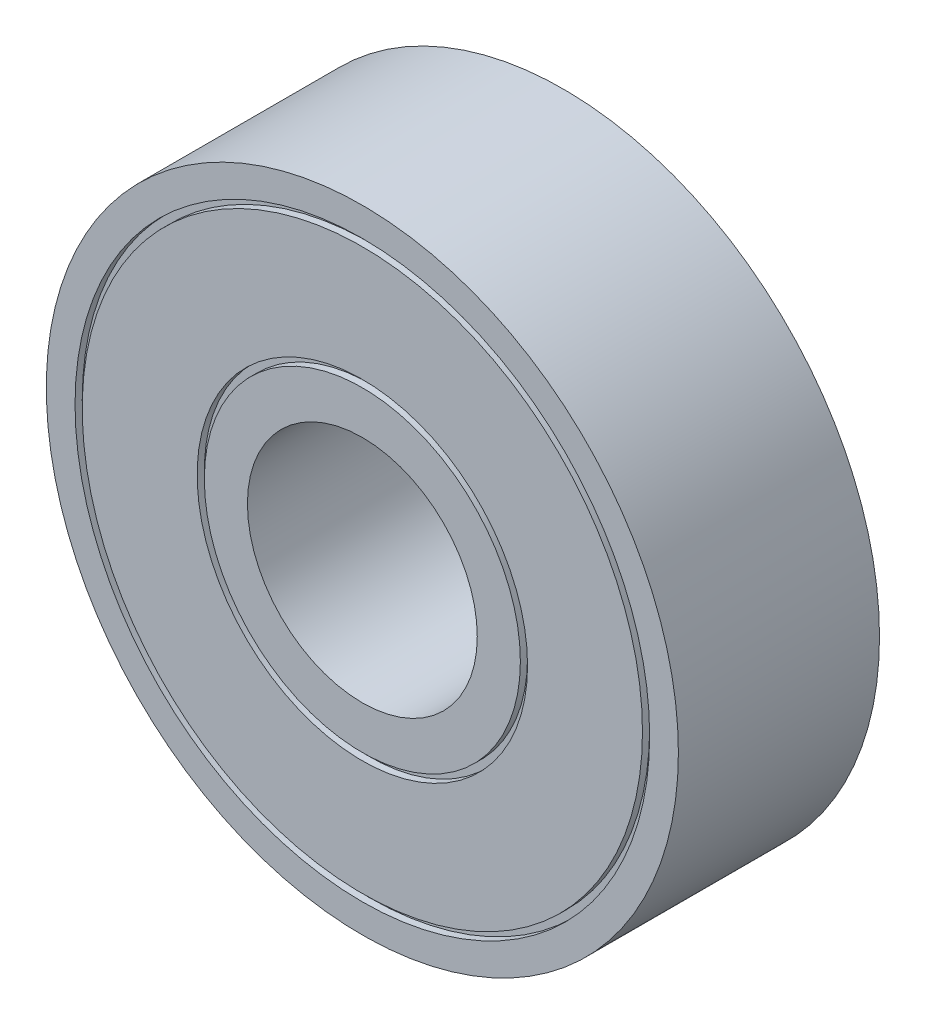
ISO-10303-21;
HEADER;
FILE_DESCRIPTION(('STEP AP214'),'2;1');
FILE_NAME('part.step','',(''),(''),'','','');
FILE_SCHEMA(('AUTOMOTIVE_DESIGN { 1 0 10303 214 1 1 1 1 }'));
ENDSEC;
DATA;
#1=APPLICATION_CONTEXT('core data for automotive mechanical design processes');
#2=APPLICATION_PROTOCOL_DEFINITION('international standard','automotive_design',2000,#1);
#3=PRODUCT_CONTEXT('',#1,'mechanical');
#4=PRODUCT('Part','Part','',(#3));
#5=PRODUCT_RELATED_PRODUCT_CATEGORY('part','',(#4));
#6=PRODUCT_DEFINITION_FORMATION('','',#4);
#7=PRODUCT_DEFINITION_CONTEXT('part definition',#1,'design');
#8=PRODUCT_DEFINITION('design','',#6,#7);
#9=PRODUCT_DEFINITION_SHAPE('','',#8);
#10=(LENGTH_UNIT() NAMED_UNIT(*) SI_UNIT(.MILLI.,.METRE.));
#11=(NAMED_UNIT(*) PLANE_ANGLE_UNIT() SI_UNIT($,.RADIAN.));
#12=(NAMED_UNIT(*) SI_UNIT($,.STERADIAN.) SOLID_ANGLE_UNIT());
#13=UNCERTAINTY_MEASURE_WITH_UNIT(LENGTH_MEASURE(1.E-05),#10,'distance_accuracy_value','');
#14=(GEOMETRIC_REPRESENTATION_CONTEXT(3) GLOBAL_UNCERTAINTY_ASSIGNED_CONTEXT((#13)) GLOBAL_UNIT_ASSIGNED_CONTEXT((#10,
#11,#12)) REPRESENTATION_CONTEXT('',''));
#15=CARTESIAN_POINT('',(0.,0.,0.));
#16=DIRECTION('',(0.,0.,1.));
#17=DIRECTION('',(1.,0.,0.));
#18=AXIS2_PLACEMENT_3D('',#15,#16,#17);
#19=CARTESIAN_POINT('',(0.,0.,-3.5));
#20=DIRECTION('',(0.,0.,1.));
#21=DIRECTION('',(1.,0.,0.));
#22=AXIS2_PLACEMENT_3D('',#19,#20,#21);
#23=PLANE('',#22);
#24=CARTESIAN_POINT('',(0.,0.,-3.5));
#25=DIRECTION('',(0.,0.,1.));
#26=DIRECTION('',(1.,0.,0.));
#27=AXIS2_PLACEMENT_3D('',#24,#25,#26);
#28=CIRCLE('',#27,4.);
#29=CARTESIAN_POINT('',(4.,0.,-3.5));
#30=VERTEX_POINT('',#29);
#31=EDGE_CURVE('E65',#30,#30,#28,.T.);
#32=ORIENTED_EDGE('',*,*,#31,.T.);
#33=EDGE_LOOP('',(#32));
#34=FACE_BOUND('',#33,.T.);
#35=CARTESIAN_POINT('',(0.,0.,-3.5));
#36=DIRECTION('',(0.,0.,1.));
#37=DIRECTION('',(1.,0.,0.));
#38=AXIS2_PLACEMENT_3D('',#35,#36,#37);
#39=CIRCLE('',#38,5.5);
#40=CARTESIAN_POINT('',(5.5,0.,-3.5));
#41=VERTEX_POINT('',#40);
#42=EDGE_CURVE('E110',#41,#41,#39,.T.);
#43=ORIENTED_EDGE('',*,*,#42,.F.);
#44=EDGE_LOOP('',(#43));
#45=FACE_BOUND('',#44,.T.);
#46=ADVANCED_FACE('F50',(#34,#45),#23,.F.);
#47=CARTESIAN_POINT('',(0.,0.,3.5));
#48=DIRECTION('',(0.,0.,1.));
#49=DIRECTION('',(1.,0.,0.));
#50=AXIS2_PLACEMENT_3D('',#47,#48,#49);
#51=PLANE('',#50);
#52=CARTESIAN_POINT('',(0.,0.,3.5));
#53=DIRECTION('',(0.,0.,1.));
#54=DIRECTION('',(1.,0.,0.));
#55=AXIS2_PLACEMENT_3D('',#52,#53,#54);
#56=CIRCLE('',#55,4.);
#57=CARTESIAN_POINT('',(4.,0.,3.5));
#58=VERTEX_POINT('',#57);
#59=EDGE_CURVE('E63',#58,#58,#56,.T.);
#60=ORIENTED_EDGE('',*,*,#59,.F.);
#61=EDGE_LOOP('',(#60));
#62=FACE_BOUND('',#61,.T.);
#63=CARTESIAN_POINT('',(0.,0.,3.5));
#64=DIRECTION('',(0.,0.,1.));
#65=DIRECTION('',(1.,0.,0.));
#66=AXIS2_PLACEMENT_3D('',#63,#64,#65);
#67=CIRCLE('',#66,5.5);
#68=CARTESIAN_POINT('',(5.5,0.,3.5));
#69=VERTEX_POINT('',#68);
#70=EDGE_CURVE('E78',#69,#69,#67,.T.);
#71=ORIENTED_EDGE('',*,*,#70,.T.);
#72=EDGE_LOOP('',(#71));
#73=FACE_BOUND('',#72,.T.);
#74=ADVANCED_FACE('F158',(#62,#73),#51,.T.);
#75=CARTESIAN_POINT('',(0.,0.,3.5));
#76=DIRECTION('',(0.,0.,1.));
#77=DIRECTION('',(1.,0.,0.));
#78=AXIS2_PLACEMENT_3D('',#75,#76,#77);
#79=CIRCLE('',#78,10.);
#80=CARTESIAN_POINT('',(10.,0.,3.5));
#81=VERTEX_POINT('',#80);
#82=EDGE_CURVE('E89',#81,#81,#79,.T.);
#83=ORIENTED_EDGE('',*,*,#82,.F.);
#84=EDGE_LOOP('',(#83));
#85=FACE_BOUND('',#84,.T.);
#86=CARTESIAN_POINT('',(0.,0.,3.5));
#87=DIRECTION('',(0.,0.,1.));
#88=DIRECTION('',(1.,0.,0.));
#89=AXIS2_PLACEMENT_3D('',#86,#87,#88);
#90=CIRCLE('',#89,11.);
#91=CARTESIAN_POINT('',(11.,0.,3.5));
#92=VERTEX_POINT('',#91);
#93=EDGE_CURVE('E11',#92,#92,#90,.T.);
#94=ORIENTED_EDGE('',*,*,#93,.T.);
#95=EDGE_LOOP('',(#94));
#96=FACE_BOUND('',#95,.T.);
#97=ADVANCED_FACE('F161',(#85,#96),#51,.T.);
#98=CARTESIAN_POINT('',(0.,0.,-3.5));
#99=DIRECTION('',(0.,0.,1.));
#100=DIRECTION('',(1.,0.,0.));
#101=AXIS2_PLACEMENT_3D('',#98,#99,#100);
#102=CIRCLE('',#101,10.);
#103=CARTESIAN_POINT('',(10.,0.,-3.5));
#104=VERTEX_POINT('',#103);
#105=EDGE_CURVE('E121',#104,#104,#102,.T.);
#106=ORIENTED_EDGE('',*,*,#105,.T.);
#107=EDGE_LOOP('',(#106));
#108=FACE_BOUND('',#107,.T.);
#109=CARTESIAN_POINT('',(0.,0.,-3.5));
#110=DIRECTION('',(0.,0.,1.));
#111=DIRECTION('',(1.,0.,0.));
#112=AXIS2_PLACEMENT_3D('',#109,#110,#111);
#113=CIRCLE('',#112,11.);
#114=CARTESIAN_POINT('',(11.,0.,-3.5));
#115=VERTEX_POINT('',#114);
#116=EDGE_CURVE('E54',#115,#115,#113,.T.);
#117=ORIENTED_EDGE('',*,*,#116,.F.);
#118=EDGE_LOOP('',(#117));
#119=FACE_BOUND('',#118,.T.);
#120=ADVANCED_FACE('F151',(#108,#119),#23,.F.);
#121=CARTESIAN_POINT('',(0.,0.,3.5));
#122=DIRECTION('',(0.,0.,-1.));
#123=DIRECTION('',(-1.,0.,0.));
#124=AXIS2_PLACEMENT_3D('',#121,#122,#123);
#125=CYLINDRICAL_SURFACE('',#124,11.);
#126=ORIENTED_EDGE('',*,*,#93,.F.);
#127=EDGE_LOOP('',(#126));
#128=FACE_BOUND('',#127,.T.);
#129=ORIENTED_EDGE('',*,*,#116,.T.);
#130=EDGE_LOOP('',(#129));
#131=FACE_BOUND('',#130,.T.);
#132=ADVANCED_FACE('F52',(#128,#131),#125,.T.);
#133=CARTESIAN_POINT('',(0.,0.,3.5));
#134=DIRECTION('',(0.,0.,-1.));
#135=DIRECTION('',(-1.,0.,0.));
#136=AXIS2_PLACEMENT_3D('',#133,#134,#135);
#137=CYLINDRICAL_SURFACE('',#136,4.);
#138=ORIENTED_EDGE('',*,*,#59,.T.);
#139=EDGE_LOOP('',(#138));
#140=FACE_BOUND('',#139,.T.);
#141=ORIENTED_EDGE('',*,*,#31,.F.);
#142=EDGE_LOOP('',(#141));
#143=FACE_BOUND('',#142,.T.);
#144=ADVANCED_FACE('F167',(#140,#143),#137,.F.);
#145=CARTESIAN_POINT('',(0.,0.,3.25));
#146=DIRECTION('',(0.,0.,1.));
#147=DIRECTION('',(1.,0.,0.));
#148=AXIS2_PLACEMENT_3D('',#145,#146,#147);
#149=CYLINDRICAL_SURFACE('',#148,5.5);
#150=CARTESIAN_POINT('',(0.,0.,3.25));
#151=DIRECTION('',(0.,0.,1.));
#152=DIRECTION('',(1.,0.,0.));
#153=AXIS2_PLACEMENT_3D('',#150,#151,#152);
#154=CIRCLE('',#153,5.5);
#155=CARTESIAN_POINT('',(5.5,0.,3.25));
#156=VERTEX_POINT('',#155);
#157=EDGE_CURVE('E77',#156,#156,#154,.T.);
#158=ORIENTED_EDGE('',*,*,#157,.T.);
#159=EDGE_LOOP('',(#158));
#160=FACE_BOUND('',#159,.T.);
#161=ORIENTED_EDGE('',*,*,#70,.F.);
#162=EDGE_LOOP('',(#161));
#163=FACE_BOUND('',#162,.T.);
#164=ADVANCED_FACE('F212',(#160,#163),#149,.T.);
#165=CARTESIAN_POINT('',(0.,0.,3.25));
#166=DIRECTION('',(0.,0.,1.));
#167=DIRECTION('',(1.,0.,0.));
#168=AXIS2_PLACEMENT_3D('',#165,#166,#167);
#169=CYLINDRICAL_SURFACE('',#168,5.75);
#170=CARTESIAN_POINT('',(0.,0.,3.25));
#171=DIRECTION('',(0.,0.,1.));
#172=DIRECTION('',(1.,0.,0.));
#173=AXIS2_PLACEMENT_3D('',#170,#171,#172);
#174=CIRCLE('',#173,5.75);
#175=CARTESIAN_POINT('',(5.75,0.,3.25));
#176=VERTEX_POINT('',#175);
#177=EDGE_CURVE('E69',#176,#176,#174,.T.);
#178=ORIENTED_EDGE('',*,*,#177,.F.);
#179=EDGE_LOOP('',(#178));
#180=FACE_BOUND('',#179,.T.);
#181=CARTESIAN_POINT('',(0.,0.,3.5));
#182=DIRECTION('',(0.,0.,1.));
#183=DIRECTION('',(1.,0.,0.));
#184=AXIS2_PLACEMENT_3D('',#181,#182,#183);
#185=CIRCLE('',#184,5.75);
#186=CARTESIAN_POINT('',(5.75,0.,3.5));
#187=VERTEX_POINT('',#186);
#188=EDGE_CURVE('E73',#187,#187,#185,.T.);
#189=ORIENTED_EDGE('',*,*,#188,.T.);
#190=EDGE_LOOP('',(#189));
#191=FACE_BOUND('',#190,.T.);
#192=ADVANCED_FACE('F208',(#180,#191),#169,.F.);
#193=CARTESIAN_POINT('',(0.,0.,3.25));
#194=DIRECTION('',(0.,0.,1.));
#195=DIRECTION('',(1.,0.,0.));
#196=AXIS2_PLACEMENT_3D('',#193,#194,#195);
#197=PLANE('',#196);
#198=ORIENTED_EDGE('',*,*,#157,.F.);
#199=EDGE_LOOP('',(#198));
#200=FACE_BOUND('',#199,.T.);
#201=ORIENTED_EDGE('',*,*,#177,.T.);
#202=EDGE_LOOP('',(#201));
#203=FACE_BOUND('',#202,.T.);
#204=ADVANCED_FACE('F204',(#200,#203),#197,.T.);
#205=CARTESIAN_POINT('',(0.,0.,3.25));
#206=DIRECTION('',(0.,0.,1.));
#207=DIRECTION('',(1.,0.,0.));
#208=AXIS2_PLACEMENT_3D('',#205,#206,#207);
#209=CYLINDRICAL_SURFACE('',#208,9.75);
#210=CARTESIAN_POINT('',(0.,0.,3.25));
#211=DIRECTION('',(0.,0.,1.));
#212=DIRECTION('',(1.,0.,0.));
#213=AXIS2_PLACEMENT_3D('',#210,#211,#212);
#214=CIRCLE('',#213,9.75);
#215=CARTESIAN_POINT('',(9.75,0.,3.25));
#216=VERTEX_POINT('',#215);
#217=EDGE_CURVE('E93',#216,#216,#214,.T.);
#218=ORIENTED_EDGE('',*,*,#217,.T.);
#219=EDGE_LOOP('',(#218));
#220=FACE_BOUND('',#219,.T.);
#221=CARTESIAN_POINT('',(0.,0.,3.5));
#222=DIRECTION('',(0.,0.,1.));
#223=DIRECTION('',(1.,0.,0.));
#224=AXIS2_PLACEMENT_3D('',#221,#222,#223);
#225=CIRCLE('',#224,9.75);
#226=CARTESIAN_POINT('',(9.75,0.,3.5));
#227=VERTEX_POINT('',#226);
#228=EDGE_CURVE('E94',#227,#227,#225,.T.);
#229=ORIENTED_EDGE('',*,*,#228,.F.);
#230=EDGE_LOOP('',(#229));
#231=FACE_BOUND('',#230,.T.);
#232=ADVANCED_FACE('F200',(#220,#231),#209,.T.);
#233=CARTESIAN_POINT('',(0.,0.,3.25));
#234=DIRECTION('',(0.,0.,1.));
#235=DIRECTION('',(1.,0.,0.));
#236=AXIS2_PLACEMENT_3D('',#233,#234,#235);
#237=CYLINDRICAL_SURFACE('',#236,10.);
#238=CARTESIAN_POINT('',(0.,0.,3.25));
#239=DIRECTION('',(0.,0.,1.));
#240=DIRECTION('',(1.,0.,0.));
#241=AXIS2_PLACEMENT_3D('',#238,#239,#240);
#242=CIRCLE('',#241,10.);
#243=CARTESIAN_POINT('',(10.,0.,3.25));
#244=VERTEX_POINT('',#243);
#245=EDGE_CURVE('E82',#244,#244,#242,.T.);
#246=ORIENTED_EDGE('',*,*,#245,.F.);
#247=EDGE_LOOP('',(#246));
#248=FACE_BOUND('',#247,.T.);
#249=ORIENTED_EDGE('',*,*,#82,.T.);
#250=EDGE_LOOP('',(#249));
#251=FACE_BOUND('',#250,.T.);
#252=ADVANCED_FACE('F196',(#248,#251),#237,.F.);
#253=CARTESIAN_POINT('',(0.,0.,3.25));
#254=DIRECTION('',(0.,0.,1.));
#255=DIRECTION('',(1.,0.,0.));
#256=AXIS2_PLACEMENT_3D('',#253,#254,#255);
#257=PLANE('',#256);
#258=ORIENTED_EDGE('',*,*,#217,.F.);
#259=EDGE_LOOP('',(#258));
#260=FACE_BOUND('',#259,.T.);
#261=ORIENTED_EDGE('',*,*,#245,.T.);
#262=EDGE_LOOP('',(#261));
#263=FACE_BOUND('',#262,.T.);
#264=ADVANCED_FACE('F193',(#260,#263),#257,.T.);
#265=ORIENTED_EDGE('',*,*,#188,.F.);
#266=EDGE_LOOP('',(#265));
#267=FACE_BOUND('',#266,.T.);
#268=ORIENTED_EDGE('',*,*,#228,.T.);
#269=EDGE_LOOP('',(#268));
#270=FACE_BOUND('',#269,.T.);
#271=ADVANCED_FACE('F170',(#267,#270),#51,.T.);
#272=CARTESIAN_POINT('',(0.,0.,-3.25));
#273=DIRECTION('',(0.,0.,-1.));
#274=DIRECTION('',(-1.,0.,0.));
#275=AXIS2_PLACEMENT_3D('',#272,#273,#274);
#276=CYLINDRICAL_SURFACE('',#275,5.5);
#277=CARTESIAN_POINT('',(0.,0.,-3.25));
#278=DIRECTION('',(0.,0.,1.));
#279=DIRECTION('',(1.,0.,0.));
#280=AXIS2_PLACEMENT_3D('',#277,#278,#279);
#281=CIRCLE('',#280,5.5);
#282=CARTESIAN_POINT('',(5.5,0.,-3.25));
#283=VERTEX_POINT('',#282);
#284=EDGE_CURVE('E109',#283,#283,#281,.T.);
#285=ORIENTED_EDGE('',*,*,#284,.F.);
#286=EDGE_LOOP('',(#285));
#287=FACE_BOUND('',#286,.T.);
#288=ORIENTED_EDGE('',*,*,#42,.T.);
#289=EDGE_LOOP('',(#288));
#290=FACE_BOUND('',#289,.T.);
#291=ADVANCED_FACE('F188',(#287,#290),#276,.T.);
#292=CARTESIAN_POINT('',(0.,0.,-3.25));
#293=DIRECTION('',(0.,0.,-1.));
#294=DIRECTION('',(-1.,0.,0.));
#295=AXIS2_PLACEMENT_3D('',#292,#293,#294);
#296=CYLINDRICAL_SURFACE('',#295,5.75);
#297=CARTESIAN_POINT('',(0.,0.,-3.25));
#298=DIRECTION('',(0.,0.,1.));
#299=DIRECTION('',(1.,0.,0.));
#300=AXIS2_PLACEMENT_3D('',#297,#298,#299);
#301=CIRCLE('',#300,5.75);
#302=CARTESIAN_POINT('',(5.75,0.,-3.25));
#303=VERTEX_POINT('',#302);
#304=EDGE_CURVE('E98',#303,#303,#301,.T.);
#305=ORIENTED_EDGE('',*,*,#304,.T.);
#306=EDGE_LOOP('',(#305));
#307=FACE_BOUND('',#306,.T.);
#308=CARTESIAN_POINT('',(0.,0.,-3.5));
#309=DIRECTION('',(0.,0.,1.));
#310=DIRECTION('',(1.,0.,0.));
#311=AXIS2_PLACEMENT_3D('',#308,#309,#310);
#312=CIRCLE('',#311,5.75);
#313=CARTESIAN_POINT('',(5.75,0.,-3.5));
#314=VERTEX_POINT('',#313);
#315=EDGE_CURVE('E105',#314,#314,#312,.T.);
#316=ORIENTED_EDGE('',*,*,#315,.F.);
#317=EDGE_LOOP('',(#316));
#318=FACE_BOUND('',#317,.T.);
#319=ADVANCED_FACE('F184',(#307,#318),#296,.F.);
#320=CARTESIAN_POINT('',(0.,0.,-3.25));
#321=DIRECTION('',(0.,0.,-1.));
#322=DIRECTION('',(1.,0.,0.));
#323=AXIS2_PLACEMENT_3D('',#320,#321,#322);
#324=PLANE('',#323);
#325=ORIENTED_EDGE('',*,*,#284,.T.);
#326=EDGE_LOOP('',(#325));
#327=FACE_BOUND('',#326,.T.);
#328=ORIENTED_EDGE('',*,*,#304,.F.);
#329=EDGE_LOOP('',(#328));
#330=FACE_BOUND('',#329,.T.);
#331=ADVANCED_FACE('F144',(#327,#330),#324,.T.);
#332=CARTESIAN_POINT('',(0.,0.,-3.25));
#333=DIRECTION('',(0.,0.,-1.));
#334=DIRECTION('',(-1.,0.,0.));
#335=AXIS2_PLACEMENT_3D('',#332,#333,#334);
#336=CYLINDRICAL_SURFACE('',#335,9.75);
#337=CARTESIAN_POINT('',(0.,0.,-3.25));
#338=DIRECTION('',(0.,0.,1.));
#339=DIRECTION('',(1.,0.,0.));
#340=AXIS2_PLACEMENT_3D('',#337,#338,#339);
#341=CIRCLE('',#340,9.75);
#342=CARTESIAN_POINT('',(9.75,0.,-3.25));
#343=VERTEX_POINT('',#342);
#344=EDGE_CURVE('E125',#343,#343,#341,.T.);
#345=ORIENTED_EDGE('',*,*,#344,.F.);
#346=EDGE_LOOP('',(#345));
#347=FACE_BOUND('',#346,.T.);
#348=CARTESIAN_POINT('',(0.,0.,-3.5));
#349=DIRECTION('',(0.,0.,1.));
#350=DIRECTION('',(1.,0.,0.));
#351=AXIS2_PLACEMENT_3D('',#348,#349,#350);
#352=CIRCLE('',#351,9.75);
#353=CARTESIAN_POINT('',(9.75,0.,-3.5));
#354=VERTEX_POINT('',#353);
#355=EDGE_CURVE('E126',#354,#354,#352,.T.);
#356=ORIENTED_EDGE('',*,*,#355,.T.);
#357=EDGE_LOOP('',(#356));
#358=FACE_BOUND('',#357,.T.);
#359=ADVANCED_FACE('F140',(#347,#358),#336,.T.);
#360=CARTESIAN_POINT('',(0.,0.,-3.25));
#361=DIRECTION('',(0.,0.,-1.));
#362=DIRECTION('',(-1.,0.,0.));
#363=AXIS2_PLACEMENT_3D('',#360,#361,#362);
#364=CYLINDRICAL_SURFACE('',#363,10.);
#365=CARTESIAN_POINT('',(0.,0.,-3.25));
#366=DIRECTION('',(0.,0.,1.));
#367=DIRECTION('',(1.,0.,0.));
#368=AXIS2_PLACEMENT_3D('',#365,#366,#367);
#369=CIRCLE('',#368,10.);
#370=CARTESIAN_POINT('',(10.,0.,-3.25));
#371=VERTEX_POINT('',#370);
#372=EDGE_CURVE('E114',#371,#371,#369,.T.);
#373=ORIENTED_EDGE('',*,*,#372,.T.);
#374=EDGE_LOOP('',(#373));
#375=FACE_BOUND('',#374,.T.);
#376=ORIENTED_EDGE('',*,*,#105,.F.);
#377=EDGE_LOOP('',(#376));
#378=FACE_BOUND('',#377,.T.);
#379=ADVANCED_FACE('F143',(#375,#378),#364,.F.);
#380=CARTESIAN_POINT('',(0.,0.,-3.25));
#381=DIRECTION('',(0.,0.,-1.));
#382=DIRECTION('',(1.,0.,0.));
#383=AXIS2_PLACEMENT_3D('',#380,#381,#382);
#384=PLANE('',#383);
#385=ORIENTED_EDGE('',*,*,#344,.T.);
#386=EDGE_LOOP('',(#385));
#387=FACE_BOUND('',#386,.T.);
#388=ORIENTED_EDGE('',*,*,#372,.F.);
#389=EDGE_LOOP('',(#388));
#390=FACE_BOUND('',#389,.T.);
#391=ADVANCED_FACE('F137',(#387,#390),#384,.T.);
#392=ORIENTED_EDGE('',*,*,#315,.T.);
#393=EDGE_LOOP('',(#392));
#394=FACE_BOUND('',#393,.T.);
#395=ORIENTED_EDGE('',*,*,#355,.F.);
#396=EDGE_LOOP('',(#395));
#397=FACE_BOUND('',#396,.T.);
#398=ADVANCED_FACE('F148',(#394,#397),#23,.F.);
#399=CLOSED_SHELL('',(#46,#74,#97,#120,#132,#144,#164,#192,#204,#232,#252,#264,#271,#291,#319,
#331,#359,#379,#391,#398));
#400=MANIFOLD_SOLID_BREP('B2',#399);
#401=ADVANCED_BREP_SHAPE_REPRESENTATION('',(#18,#400),#14);
#402=SHAPE_DEFINITION_REPRESENTATION(#9,#401);
ENDSEC;
END-ISO-10303-21;
